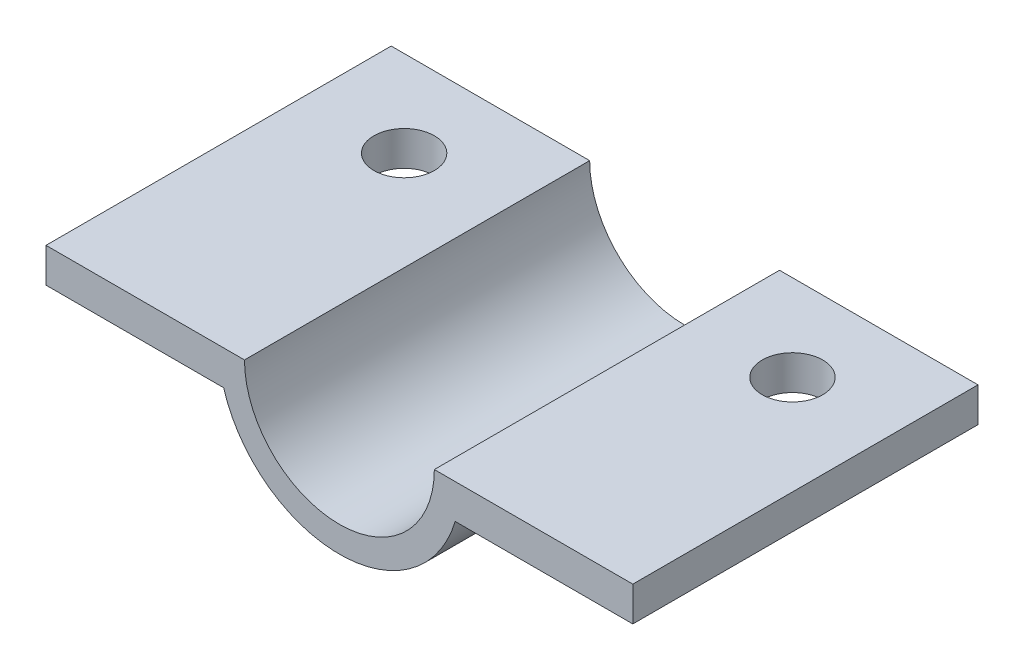
ISO-10303-21;
HEADER;
FILE_DESCRIPTION(('STEP AP214'),'2;1');
FILE_NAME('part.step','',(''),(''),'','','');
FILE_SCHEMA(('AUTOMOTIVE_DESIGN { 1 0 10303 214 1 1 1 1 }'));
ENDSEC;
DATA;
#1=APPLICATION_CONTEXT('core data for automotive mechanical design processes');
#2=APPLICATION_PROTOCOL_DEFINITION('international standard','automotive_design',2000,#1);
#3=PRODUCT_CONTEXT('',#1,'mechanical');
#4=PRODUCT('Part','Part','',(#3));
#5=PRODUCT_RELATED_PRODUCT_CATEGORY('part','',(#4));
#6=PRODUCT_DEFINITION_FORMATION('','',#4);
#7=PRODUCT_DEFINITION_CONTEXT('part definition',#1,'design');
#8=PRODUCT_DEFINITION('design','',#6,#7);
#9=PRODUCT_DEFINITION_SHAPE('','',#8);
#10=(LENGTH_UNIT() NAMED_UNIT(*) SI_UNIT(.MILLI.,.METRE.));
#11=(NAMED_UNIT(*) PLANE_ANGLE_UNIT() SI_UNIT($,.RADIAN.));
#12=(NAMED_UNIT(*) SI_UNIT($,.STERADIAN.) SOLID_ANGLE_UNIT());
#13=UNCERTAINTY_MEASURE_WITH_UNIT(LENGTH_MEASURE(1.E-05),#10,'distance_accuracy_value','');
#14=(GEOMETRIC_REPRESENTATION_CONTEXT(3) GLOBAL_UNCERTAINTY_ASSIGNED_CONTEXT((#13)) GLOBAL_UNIT_ASSIGNED_CONTEXT((#10,
#11,#12)) REPRESENTATION_CONTEXT('',''));
#15=CARTESIAN_POINT('',(0.,0.,0.));
#16=DIRECTION('',(0.,0.,1.));
#17=DIRECTION('',(1.,0.,0.));
#18=AXIS2_PLACEMENT_3D('',#15,#16,#17);
#19=CARTESIAN_POINT('',(0.,9.77815625516572,25.4));
#20=DIRECTION('',(0.,1.,0.));
#21=DIRECTION('',(-1.,0.,0.));
#22=AXIS2_PLACEMENT_3D('',#19,#20,#21);
#23=PLANE('',#22);
#24=CARTESIAN_POINT('',(-14.2875,9.77815625516571,6.35));
#25=DIRECTION('',(0.,1.,0.));
#26=DIRECTION('',(-1.,0.,0.));
#27=AXIS2_PLACEMENT_3D('',#24,#25,#26);
#28=CIRCLE('',#27,2.2225);
#29=CARTESIAN_POINT('',(-16.51,9.77815625516571,6.35));
#30=VERTEX_POINT('',#29);
#31=EDGE_CURVE('E213',#30,#30,#28,.T.);
#32=ORIENTED_EDGE('',*,*,#31,.T.);
#33=EDGE_LOOP('',(#32));
#34=FACE_BOUND('',#33,.T.);
#35=DIRECTION('',(1.,0.,0.));
#36=VECTOR('',#35,1.);
#37=CARTESIAN_POINT('',(0.,9.77815625516572,0.));
#38=LINE('',#37,#36);
#39=CARTESIAN_POINT('',(-21.59,9.77815625516571,0.));
#40=VERTEX_POINT('',#39);
#41=CARTESIAN_POINT('',(-8.51941899427419,9.77815625516572,0.));
#42=VERTEX_POINT('',#41);
#43=EDGE_CURVE('E146',#40,#42,#38,.T.);
#44=ORIENTED_EDGE('',*,*,#43,.T.);
#45=DIRECTION('',(0.,0.,-1.));
#46=VECTOR('',#45,1.);
#47=CARTESIAN_POINT('',(-8.51941899427419,9.77815625516572,25.4));
#48=LINE('',#47,#46);
#49=CARTESIAN_POINT('',(-8.51941899427419,9.77815625516572,25.4));
#50=VERTEX_POINT('',#49);
#51=EDGE_CURVE('E11',#50,#42,#48,.T.);
#52=ORIENTED_EDGE('',*,*,#51,.F.);
#53=DIRECTION('',(1.,0.,0.));
#54=VECTOR('',#53,1.);
#55=CARTESIAN_POINT('',(0.,9.77815625516572,25.4));
#56=LINE('',#55,#54);
#57=CARTESIAN_POINT('',(-21.59,9.77815625516571,25.4));
#58=VERTEX_POINT('',#57);
#59=EDGE_CURVE('E173',#58,#50,#56,.T.);
#60=ORIENTED_EDGE('',*,*,#59,.F.);
#61=DIRECTION('',(0.,0.,-1.));
#62=VECTOR('',#61,1.);
#63=CARTESIAN_POINT('',(-21.59,9.77815625516571,25.4));
#64=LINE('',#63,#62);
#65=EDGE_CURVE('E145',#58,#40,#64,.T.);
#66=ORIENTED_EDGE('',*,*,#65,.T.);
#67=EDGE_LOOP('',(#44,#52,#60,#66));
#68=FACE_BOUND('',#67,.T.);
#69=ADVANCED_FACE('F42',(#34,#68),#23,.F.);
#70=CARTESIAN_POINT('',(0.,12.3181562551657,25.4));
#71=DIRECTION('',(0.,0.,-1.));
#72=DIRECTION('',(-1.,0.,0.));
#73=AXIS2_PLACEMENT_3D('',#70,#71,#72);
#74=CYLINDRICAL_SURFACE('',#73,8.89);
#75=CARTESIAN_POINT('',(0.,12.3181562551657,0.));
#76=DIRECTION('',(0.,0.,1.));
#77=DIRECTION('',(1.,0.,0.));
#78=AXIS2_PLACEMENT_3D('',#75,#76,#77);
#79=CIRCLE('',#78,8.89);
#80=CARTESIAN_POINT('',(8.51941899427419,9.77815625516572,0.));
#81=VERTEX_POINT('',#80);
#82=EDGE_CURVE('E150',#42,#81,#79,.T.);
#83=ORIENTED_EDGE('',*,*,#82,.T.);
#84=DIRECTION('',(0.,0.,-1.));
#85=VECTOR('',#84,1.);
#86=CARTESIAN_POINT('',(8.51941899427419,9.77815625516572,25.4));
#87=LINE('',#86,#85);
#88=CARTESIAN_POINT('',(8.51941899427419,9.77815625516572,25.4));
#89=VERTEX_POINT('',#88);
#90=EDGE_CURVE('E51',#89,#81,#87,.T.);
#91=ORIENTED_EDGE('',*,*,#90,.F.);
#92=CARTESIAN_POINT('',(0.,12.3181562551657,25.4));
#93=DIRECTION('',(0.,0.,1.));
#94=DIRECTION('',(1.,0.,0.));
#95=AXIS2_PLACEMENT_3D('',#92,#93,#94);
#96=CIRCLE('',#95,8.89);
#97=EDGE_CURVE('E101',#50,#89,#96,.T.);
#98=ORIENTED_EDGE('',*,*,#97,.F.);
#99=ORIENTED_EDGE('',*,*,#51,.T.);
#100=EDGE_LOOP('',(#83,#91,#98,#99));
#101=FACE_BOUND('',#100,.T.);
#102=ADVANCED_FACE('F192',(#101),#74,.T.);
#103=CARTESIAN_POINT('',(0.,9.77815625516572,25.4));
#104=DIRECTION('',(0.,-1.,0.));
#105=DIRECTION('',(1.,0.,0.));
#106=AXIS2_PLACEMENT_3D('',#103,#104,#105);
#107=PLANE('',#106);
#108=CARTESIAN_POINT('',(14.2875,9.77815625516572,6.35));
#109=DIRECTION('',(0.,-1.,0.));
#110=DIRECTION('',(1.,0.,0.));
#111=AXIS2_PLACEMENT_3D('',#108,#109,#110);
#112=CIRCLE('',#111,2.2225);
#113=CARTESIAN_POINT('',(16.51,9.77815625516572,6.35));
#114=VERTEX_POINT('',#113);
#115=EDGE_CURVE('E151',#114,#114,#112,.T.);
#116=ORIENTED_EDGE('',*,*,#115,.F.);
#117=EDGE_LOOP('',(#116));
#118=FACE_BOUND('',#117,.T.);
#119=DIRECTION('',(-1.,0.,0.));
#120=VECTOR('',#119,1.);
#121=CARTESIAN_POINT('',(0.,9.77815625516572,0.));
#122=LINE('',#121,#120);
#123=CARTESIAN_POINT('',(21.59,9.77815625516572,0.));
#124=VERTEX_POINT('',#123);
#125=EDGE_CURVE('E155',#124,#81,#122,.T.);
#126=ORIENTED_EDGE('',*,*,#125,.F.);
#127=DIRECTION('',(0.,0.,-1.));
#128=VECTOR('',#127,1.);
#129=CARTESIAN_POINT('',(21.59,9.77815625516572,25.4));
#130=LINE('',#129,#128);
#131=CARTESIAN_POINT('',(21.59,9.77815625516572,25.4));
#132=VERTEX_POINT('',#131);
#133=EDGE_CURVE('E183',#132,#124,#130,.T.);
#134=ORIENTED_EDGE('',*,*,#133,.F.);
#135=DIRECTION('',(-1.,0.,0.));
#136=VECTOR('',#135,1.);
#137=CARTESIAN_POINT('',(0.,9.77815625516572,25.4));
#138=LINE('',#137,#136);
#139=EDGE_CURVE('E191',#132,#89,#138,.T.);
#140=ORIENTED_EDGE('',*,*,#139,.T.);
#141=ORIENTED_EDGE('',*,*,#90,.T.);
#142=EDGE_LOOP('',(#126,#134,#140,#141));
#143=FACE_BOUND('',#142,.T.);
#144=ADVANCED_FACE('F189',(#118,#143),#107,.T.);
#145=CARTESIAN_POINT('',(21.59,0.,25.4));
#146=DIRECTION('',(1.,0.,0.));
#147=DIRECTION('',(0.,0.,-1.));
#148=AXIS2_PLACEMENT_3D('',#145,#146,#147);
#149=PLANE('',#148);
#150=DIRECTION('',(0.,-1.,0.));
#151=VECTOR('',#150,1.);
#152=CARTESIAN_POINT('',(21.59,0.,0.));
#153=LINE('',#152,#151);
#154=CARTESIAN_POINT('',(21.59,12.3181562551657,0.));
#155=VERTEX_POINT('',#154);
#156=EDGE_CURVE('E159',#155,#124,#153,.T.);
#157=ORIENTED_EDGE('',*,*,#156,.F.);
#158=DIRECTION('',(0.,0.,-1.));
#159=VECTOR('',#158,1.);
#160=CARTESIAN_POINT('',(21.59,12.3181562551657,25.4));
#161=LINE('',#160,#159);
#162=CARTESIAN_POINT('',(21.59,12.3181562551657,25.4));
#163=VERTEX_POINT('',#162);
#164=EDGE_CURVE('E180',#163,#155,#161,.T.);
#165=ORIENTED_EDGE('',*,*,#164,.F.);
#166=DIRECTION('',(0.,-1.,0.));
#167=VECTOR('',#166,1.);
#168=CARTESIAN_POINT('',(21.59,0.,25.4));
#169=LINE('',#168,#167);
#170=EDGE_CURVE('E139',#163,#132,#169,.T.);
#171=ORIENTED_EDGE('',*,*,#170,.T.);
#172=ORIENTED_EDGE('',*,*,#133,.T.);
#173=EDGE_LOOP('',(#157,#165,#171,#172));
#174=FACE_BOUND('',#173,.T.);
#175=ADVANCED_FACE('F200',(#174),#149,.T.);
#176=CARTESIAN_POINT('',(0.,12.3181562551657,25.4));
#177=DIRECTION('',(0.,-1.,0.));
#178=DIRECTION('',(0.,0.,-1.));
#179=AXIS2_PLACEMENT_3D('',#176,#177,#178);
#180=PLANE('',#179);
#181=CARTESIAN_POINT('',(14.2875,12.3181562551657,6.35));
#182=DIRECTION('',(0.,1.,0.));
#183=DIRECTION('',(1.,0.,0.));
#184=AXIS2_PLACEMENT_3D('',#181,#182,#183);
#185=CIRCLE('',#184,2.2225);
#186=CARTESIAN_POINT('',(16.51,12.3181562551657,6.35));
#187=VERTEX_POINT('',#186);
#188=EDGE_CURVE('E218',#187,#187,#185,.T.);
#189=ORIENTED_EDGE('',*,*,#188,.F.);
#190=EDGE_LOOP('',(#189));
#191=FACE_BOUND('',#190,.T.);
#192=DIRECTION('',(-1.,0.,0.));
#193=VECTOR('',#192,1.);
#194=CARTESIAN_POINT('',(0.,12.3181562551657,0.));
#195=LINE('',#194,#193);
#196=CARTESIAN_POINT('',(6.98499999999999,12.3181562551657,0.));
#197=VERTEX_POINT('',#196);
#198=EDGE_CURVE('E163',#155,#197,#195,.T.);
#199=ORIENTED_EDGE('',*,*,#198,.T.);
#200=DIRECTION('',(0.,0.,-1.));
#201=VECTOR('',#200,1.);
#202=CARTESIAN_POINT('',(6.98499999999999,12.3181562551657,25.4));
#203=LINE('',#202,#201);
#204=CARTESIAN_POINT('',(6.98499999999999,12.3181562551657,25.4));
#205=VERTEX_POINT('',#204);
#206=EDGE_CURVE('E124',#205,#197,#203,.T.);
#207=ORIENTED_EDGE('',*,*,#206,.F.);
#208=DIRECTION('',(-1.,0.,0.));
#209=VECTOR('',#208,1.);
#210=CARTESIAN_POINT('',(0.,12.3181562551657,25.4));
#211=LINE('',#210,#209);
#212=EDGE_CURVE('E134',#163,#205,#211,.T.);
#213=ORIENTED_EDGE('',*,*,#212,.F.);
#214=ORIENTED_EDGE('',*,*,#164,.T.);
#215=EDGE_LOOP('',(#199,#207,#213,#214));
#216=FACE_BOUND('',#215,.T.);
#217=ADVANCED_FACE('F237',(#191,#216),#180,.F.);
#218=CARTESIAN_POINT('',(0.,12.3181562551657,25.4));
#219=DIRECTION('',(0.,0.,-1.));
#220=DIRECTION('',(-1.,0.,0.));
#221=AXIS2_PLACEMENT_3D('',#218,#219,#220);
#222=CYLINDRICAL_SURFACE('',#221,6.985);
#223=CARTESIAN_POINT('',(0.,12.3181562551657,0.));
#224=DIRECTION('',(0.,0.,1.));
#225=DIRECTION('',(1.,0.,0.));
#226=AXIS2_PLACEMENT_3D('',#223,#224,#225);
#227=CIRCLE('',#226,6.985);
#228=CARTESIAN_POINT('',(-6.98499999999999,12.3181562551657,0.));
#229=VERTEX_POINT('',#228);
#230=EDGE_CURVE('E122',#229,#197,#227,.T.);
#231=ORIENTED_EDGE('',*,*,#230,.F.);
#232=DIRECTION('',(0.,0.,-1.));
#233=VECTOR('',#232,1.);
#234=CARTESIAN_POINT('',(-6.98499999999999,12.3181562551657,25.4));
#235=LINE('',#234,#233);
#236=CARTESIAN_POINT('',(-6.98499999999999,12.3181562551657,25.4));
#237=VERTEX_POINT('',#236);
#238=EDGE_CURVE('E116',#237,#229,#235,.T.);
#239=ORIENTED_EDGE('',*,*,#238,.F.);
#240=CARTESIAN_POINT('',(0.,12.3181562551657,25.4));
#241=DIRECTION('',(0.,0.,1.));
#242=DIRECTION('',(1.,0.,0.));
#243=AXIS2_PLACEMENT_3D('',#240,#241,#242);
#244=CIRCLE('',#243,6.985);
#245=EDGE_CURVE('E120',#237,#205,#244,.T.);
#246=ORIENTED_EDGE('',*,*,#245,.T.);
#247=ORIENTED_EDGE('',*,*,#206,.T.);
#248=EDGE_LOOP('',(#231,#239,#246,#247));
#249=FACE_BOUND('',#248,.T.);
#250=ADVANCED_FACE('F118',(#249),#222,.F.);
#251=CARTESIAN_POINT('',(0.,12.3181562551657,25.4));
#252=DIRECTION('',(0.,-1.,0.));
#253=DIRECTION('',(1.,0.,0.));
#254=AXIS2_PLACEMENT_3D('',#251,#252,#253);
#255=PLANE('',#254);
#256=CARTESIAN_POINT('',(-14.2875,12.3181562551657,6.35));
#257=DIRECTION('',(0.,1.,0.));
#258=DIRECTION('',(-1.,0.,0.));
#259=AXIS2_PLACEMENT_3D('',#256,#257,#258);
#260=CIRCLE('',#259,2.2225);
#261=CARTESIAN_POINT('',(-16.51,12.3181562551657,6.35));
#262=VERTEX_POINT('',#261);
#263=EDGE_CURVE('E217',#262,#262,#260,.T.);
#264=ORIENTED_EDGE('',*,*,#263,.F.);
#265=EDGE_LOOP('',(#264));
#266=FACE_BOUND('',#265,.T.);
#267=DIRECTION('',(-1.,0.,0.));
#268=VECTOR('',#267,1.);
#269=CARTESIAN_POINT('',(0.,12.3181562551657,0.));
#270=LINE('',#269,#268);
#271=CARTESIAN_POINT('',(-21.59,12.3181562551657,0.));
#272=VERTEX_POINT('',#271);
#273=EDGE_CURVE('E87',#229,#272,#270,.T.);
#274=ORIENTED_EDGE('',*,*,#273,.T.);
#275=DIRECTION('',(0.,0.,-1.));
#276=VECTOR('',#275,1.);
#277=CARTESIAN_POINT('',(-21.59,12.3181562551657,25.4));
#278=LINE('',#277,#276);
#279=CARTESIAN_POINT('',(-21.59,12.3181562551657,25.4));
#280=VERTEX_POINT('',#279);
#281=EDGE_CURVE('E125',#280,#272,#278,.T.);
#282=ORIENTED_EDGE('',*,*,#281,.F.);
#283=DIRECTION('',(-1.,0.,0.));
#284=VECTOR('',#283,1.);
#285=CARTESIAN_POINT('',(0.,12.3181562551657,25.4));
#286=LINE('',#285,#284);
#287=EDGE_CURVE('E127',#237,#280,#286,.T.);
#288=ORIENTED_EDGE('',*,*,#287,.F.);
#289=ORIENTED_EDGE('',*,*,#238,.T.);
#290=EDGE_LOOP('',(#274,#282,#288,#289));
#291=FACE_BOUND('',#290,.T.);
#292=ADVANCED_FACE('F128',(#266,#291),#255,.F.);
#293=CARTESIAN_POINT('',(-21.59,0.,25.4));
#294=DIRECTION('',(1.,0.,0.));
#295=DIRECTION('',(0.,0.,-1.));
#296=AXIS2_PLACEMENT_3D('',#293,#294,#295);
#297=PLANE('',#296);
#298=DIRECTION('',(0.,-1.,0.));
#299=VECTOR('',#298,1.);
#300=CARTESIAN_POINT('',(-21.59,0.,0.));
#301=LINE('',#300,#299);
#302=EDGE_CURVE('E93',#272,#40,#301,.T.);
#303=ORIENTED_EDGE('',*,*,#302,.T.);
#304=ORIENTED_EDGE('',*,*,#65,.F.);
#305=DIRECTION('',(0.,-1.,0.));
#306=VECTOR('',#305,1.);
#307=CARTESIAN_POINT('',(-21.59,0.,25.4));
#308=LINE('',#307,#306);
#309=EDGE_CURVE('E59',#280,#58,#308,.T.);
#310=ORIENTED_EDGE('',*,*,#309,.F.);
#311=ORIENTED_EDGE('',*,*,#281,.T.);
#312=EDGE_LOOP('',(#303,#304,#310,#311));
#313=FACE_BOUND('',#312,.T.);
#314=ADVANCED_FACE('F230',(#313),#297,.F.);
#315=CARTESIAN_POINT('',(0.,0.,25.4));
#316=DIRECTION('',(0.,0.,1.));
#317=DIRECTION('',(1.,0.,0.));
#318=AXIS2_PLACEMENT_3D('',#315,#316,#317);
#319=PLANE('',#318);
#320=ORIENTED_EDGE('',*,*,#59,.T.);
#321=ORIENTED_EDGE('',*,*,#97,.T.);
#322=ORIENTED_EDGE('',*,*,#139,.F.);
#323=ORIENTED_EDGE('',*,*,#170,.F.);
#324=ORIENTED_EDGE('',*,*,#212,.T.);
#325=ORIENTED_EDGE('',*,*,#245,.F.);
#326=ORIENTED_EDGE('',*,*,#287,.T.);
#327=ORIENTED_EDGE('',*,*,#309,.T.);
#328=EDGE_LOOP('',(#320,#321,#322,#323,#324,#325,#326,#327));
#329=FACE_BOUND('',#328,.T.);
#330=ADVANCED_FACE('F131',(#329),#319,.T.);
#331=CARTESIAN_POINT('',(0.,0.,0.));
#332=DIRECTION('',(0.,0.,1.));
#333=DIRECTION('',(1.,0.,0.));
#334=AXIS2_PLACEMENT_3D('',#331,#332,#333);
#335=PLANE('',#334);
#336=ORIENTED_EDGE('',*,*,#43,.F.);
#337=ORIENTED_EDGE('',*,*,#302,.F.);
#338=ORIENTED_EDGE('',*,*,#273,.F.);
#339=ORIENTED_EDGE('',*,*,#230,.T.);
#340=ORIENTED_EDGE('',*,*,#198,.F.);
#341=ORIENTED_EDGE('',*,*,#156,.T.);
#342=ORIENTED_EDGE('',*,*,#125,.T.);
#343=ORIENTED_EDGE('',*,*,#82,.F.);
#344=EDGE_LOOP('',(#336,#337,#338,#339,#340,#341,#342,#343));
#345=FACE_BOUND('',#344,.T.);
#346=ADVANCED_FACE('F196',(#345),#335,.F.);
#347=CARTESIAN_POINT('',(-14.2875,-13.0818437448343,6.35));
#348=DIRECTION('',(0.,1.,0.));
#349=DIRECTION('',(-1.,0.,0.));
#350=AXIS2_PLACEMENT_3D('',#347,#348,#349);
#351=CYLINDRICAL_SURFACE('',#350,2.2225);
#352=ORIENTED_EDGE('',*,*,#263,.T.);
#353=EDGE_LOOP('',(#352));
#354=FACE_BOUND('',#353,.T.);
#355=ORIENTED_EDGE('',*,*,#31,.F.);
#356=EDGE_LOOP('',(#355));
#357=FACE_BOUND('',#356,.T.);
#358=ADVANCED_FACE('F226',(#354,#357),#351,.F.);
#359=CARTESIAN_POINT('',(14.2875,-13.0818437448343,6.35));
#360=DIRECTION('',(0.,1.,0.));
#361=DIRECTION('',(-1.,0.,0.));
#362=AXIS2_PLACEMENT_3D('',#359,#360,#361);
#363=CYLINDRICAL_SURFACE('',#362,2.2225);
#364=ORIENTED_EDGE('',*,*,#115,.T.);
#365=EDGE_LOOP('',(#364));
#366=FACE_BOUND('',#365,.T.);
#367=ORIENTED_EDGE('',*,*,#188,.T.);
#368=EDGE_LOOP('',(#367));
#369=FACE_BOUND('',#368,.T.);
#370=ADVANCED_FACE('F248',(#366,#369),#363,.F.);
#371=CLOSED_SHELL('',(#69,#102,#144,#175,#217,#250,#292,#314,#330,#346,#358,#370));
#372=MANIFOLD_SOLID_BREP('B2',#371);
#373=ADVANCED_BREP_SHAPE_REPRESENTATION('',(#18,#372),#14);
#374=SHAPE_DEFINITION_REPRESENTATION(#9,#373);
ENDSEC;
END-ISO-10303-21;
